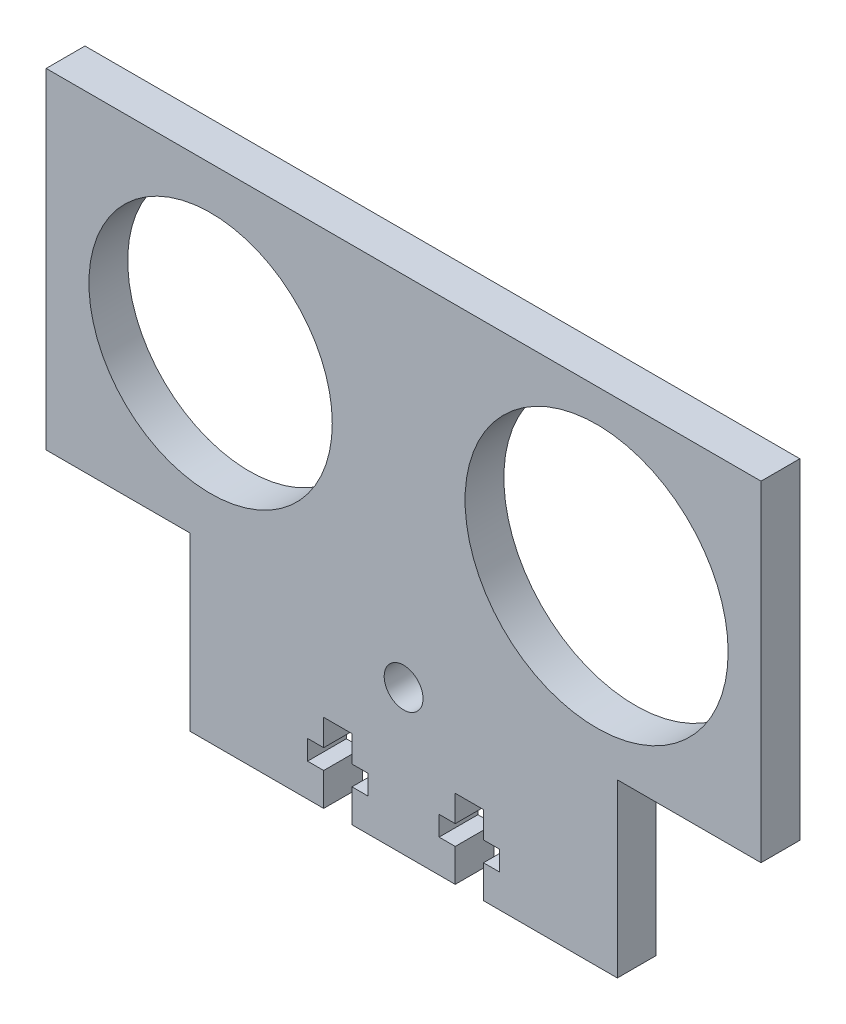
ISO-10303-21;
HEADER;
FILE_DESCRIPTION(('STEP AP214'),'2;1');
FILE_NAME('part.step','',(''),(''),'','','');
FILE_SCHEMA(('AUTOMOTIVE_DESIGN { 1 0 10303 214 1 1 1 1 }'));
ENDSEC;
DATA;
#1=APPLICATION_CONTEXT('core data for automotive mechanical design processes');
#2=APPLICATION_PROTOCOL_DEFINITION('international standard','automotive_design',2000,#1);
#3=PRODUCT_CONTEXT('',#1,'mechanical');
#4=PRODUCT('Part','Part','',(#3));
#5=PRODUCT_RELATED_PRODUCT_CATEGORY('part','',(#4));
#6=PRODUCT_DEFINITION_FORMATION('','',#4);
#7=PRODUCT_DEFINITION_CONTEXT('part definition',#1,'design');
#8=PRODUCT_DEFINITION('design','',#6,#7);
#9=PRODUCT_DEFINITION_SHAPE('','',#8);
#10=(LENGTH_UNIT() NAMED_UNIT(*) SI_UNIT(.MILLI.,.METRE.));
#11=(NAMED_UNIT(*) PLANE_ANGLE_UNIT() SI_UNIT($,.RADIAN.));
#12=(NAMED_UNIT(*) SI_UNIT($,.STERADIAN.) SOLID_ANGLE_UNIT());
#13=UNCERTAINTY_MEASURE_WITH_UNIT(LENGTH_MEASURE(1.E-05),#10,'distance_accuracy_value','');
#14=(GEOMETRIC_REPRESENTATION_CONTEXT(3) GLOBAL_UNCERTAINTY_ASSIGNED_CONTEXT((#13)) GLOBAL_UNIT_ASSIGNED_CONTEXT((#10,
#11,#12)) REPRESENTATION_CONTEXT('',''));
#15=CARTESIAN_POINT('',(0.,0.,0.));
#16=DIRECTION('',(0.,0.,1.));
#17=DIRECTION('',(1.,0.,0.));
#18=AXIS2_PLACEMENT_3D('',#15,#16,#17);
#19=CARTESIAN_POINT('',(-32.5,-22.,5.9));
#20=DIRECTION('',(0.,1.,0.));
#21=DIRECTION('',(-1.,0.,0.));
#22=AXIS2_PLACEMENT_3D('',#19,#20,#21);
#23=PLANE('',#22);
#24=DIRECTION('',(1.,0.,0.));
#25=VECTOR('',#24,1.);
#26=CARTESIAN_POINT('',(-32.5,-22.,5.9));
#27=LINE('',#26,#25);
#28=CARTESIAN_POINT('',(12.15,-22.,5.9));
#29=VERTEX_POINT('',#28);
#30=CARTESIAN_POINT('',(32.5,-22.,5.9));
#31=VERTEX_POINT('',#30);
#32=EDGE_CURVE('E453',#29,#31,#27,.T.);
#33=ORIENTED_EDGE('',*,*,#32,.F.);
#34=DIRECTION('',(0.,0.,1.));
#35=VECTOR('',#34,1.);
#36=CARTESIAN_POINT('',(12.15,-22.,0.));
#37=LINE('',#36,#35);
#38=CARTESIAN_POINT('',(12.15,-22.,0.));
#39=VERTEX_POINT('',#38);
#40=EDGE_CURVE('E335',#39,#29,#37,.T.);
#41=ORIENTED_EDGE('',*,*,#40,.F.);
#42=DIRECTION('',(1.,0.,0.));
#43=VECTOR('',#42,1.);
#44=CARTESIAN_POINT('',(-32.5,-22.,0.));
#45=LINE('',#44,#43);
#46=CARTESIAN_POINT('',(32.5,-22.,0.));
#47=VERTEX_POINT('',#46);
#48=EDGE_CURVE('E445',#39,#47,#45,.T.);
#49=ORIENTED_EDGE('',*,*,#48,.T.);
#50=DIRECTION('',(0.,0.,-1.));
#51=VECTOR('',#50,1.);
#52=CARTESIAN_POINT('',(32.5,-22.,5.9));
#53=LINE('',#52,#51);
#54=EDGE_CURVE('E11',#31,#47,#53,.T.);
#55=ORIENTED_EDGE('',*,*,#54,.F.);
#56=EDGE_LOOP('',(#33,#41,#49,#55));
#57=FACE_BOUND('',#56,.T.);
#58=ADVANCED_FACE('F32',(#57),#23,.F.);
#59=CARTESIAN_POINT('',(-32.5,-22.,0.));
#60=VERTEX_POINT('',#59);
#61=CARTESIAN_POINT('',(-12.15,-22.,0.));
#62=VERTEX_POINT('',#61);
#63=EDGE_CURVE('E468',#60,#62,#45,.T.);
#64=ORIENTED_EDGE('',*,*,#63,.T.);
#65=DIRECTION('',(0.,0.,1.));
#66=VECTOR('',#65,1.);
#67=CARTESIAN_POINT('',(-12.15,-22.,0.));
#68=LINE('',#67,#66);
#69=CARTESIAN_POINT('',(-12.15,-22.,5.9));
#70=VERTEX_POINT('',#69);
#71=EDGE_CURVE('E374',#62,#70,#68,.T.);
#72=ORIENTED_EDGE('',*,*,#71,.T.);
#73=CARTESIAN_POINT('',(-32.5,-22.,5.9));
#74=VERTEX_POINT('',#73);
#75=EDGE_CURVE('E448',#74,#70,#27,.T.);
#76=ORIENTED_EDGE('',*,*,#75,.F.);
#77=DIRECTION('',(0.,0.,-1.));
#78=VECTOR('',#77,1.);
#79=CARTESIAN_POINT('',(-32.5,-22.,5.9));
#80=LINE('',#79,#78);
#81=EDGE_CURVE('E467',#74,#60,#80,.T.);
#82=ORIENTED_EDGE('',*,*,#81,.T.);
#83=EDGE_LOOP('',(#64,#72,#76,#82));
#84=FACE_BOUND('',#83,.T.);
#85=ADVANCED_FACE('F589',(#84),#23,.F.);
#86=CARTESIAN_POINT('',(0.,0.,5.9));
#87=DIRECTION('',(0.,0.,1.));
#88=DIRECTION('',(1.,0.,0.));
#89=AXIS2_PLACEMENT_3D('',#86,#87,#88);
#90=PLANE('',#89);
#91=DIRECTION('',(0.,1.,0.));
#92=VECTOR('',#91,1.);
#93=CARTESIAN_POINT('',(12.15,-22.,5.9));
#94=LINE('',#93,#92);
#95=CARTESIAN_POINT('',(12.15,-17.,5.9));
#96=VERTEX_POINT('',#95);
#97=EDGE_CURVE('E303',#29,#96,#94,.T.);
#98=ORIENTED_EDGE('',*,*,#97,.F.);
#99=ORIENTED_EDGE('',*,*,#32,.T.);
#100=DIRECTION('',(0.,1.,0.));
#101=VECTOR('',#100,1.);
#102=CARTESIAN_POINT('',(32.5,-22.,5.9));
#103=LINE('',#102,#101);
#104=CARTESIAN_POINT('',(32.5,4.10000000000001,5.9));
#105=VERTEX_POINT('',#104);
#106=EDGE_CURVE('E451',#31,#105,#103,.T.);
#107=ORIENTED_EDGE('',*,*,#106,.T.);
#108=DIRECTION('',(1.,0.,0.));
#109=VECTOR('',#108,1.);
#110=CARTESIAN_POINT('',(54.3449314192418,4.1,5.9));
#111=LINE('',#110,#109);
#112=CARTESIAN_POINT('',(54.3449314192418,4.1,5.9));
#113=VERTEX_POINT('',#112);
#114=EDGE_CURVE('E455',#105,#113,#111,.T.);
#115=ORIENTED_EDGE('',*,*,#114,.T.);
#116=DIRECTION('',(0.,1.,0.));
#117=VECTOR('',#116,1.);
#118=CARTESIAN_POINT('',(54.3449314192418,54.3449314192417,5.9));
#119=LINE('',#118,#117);
#120=CARTESIAN_POINT('',(54.3449314192418,54.3449314192417,5.9));
#121=VERTEX_POINT('',#120);
#122=EDGE_CURVE('E457',#113,#121,#119,.T.);
#123=ORIENTED_EDGE('',*,*,#122,.T.);
#124=DIRECTION('',(-1.,0.,0.));
#125=VECTOR('',#124,1.);
#126=CARTESIAN_POINT('',(-54.3449314192418,54.3449314192417,5.9));
#127=LINE('',#126,#125);
#128=CARTESIAN_POINT('',(-54.3449314192418,54.3449314192417,5.9));
#129=VERTEX_POINT('',#128);
#130=EDGE_CURVE('E459',#121,#129,#127,.T.);
#131=ORIENTED_EDGE('',*,*,#130,.T.);
#132=DIRECTION('',(0.,-1.,0.));
#133=VECTOR('',#132,1.);
#134=CARTESIAN_POINT('',(-54.3449314192418,4.1,5.9));
#135=LINE('',#134,#133);
#136=CARTESIAN_POINT('',(-54.3449314192418,4.1,5.9));
#137=VERTEX_POINT('',#136);
#138=EDGE_CURVE('E461',#129,#137,#135,.T.);
#139=ORIENTED_EDGE('',*,*,#138,.T.);
#140=DIRECTION('',(1.,0.,0.));
#141=VECTOR('',#140,1.);
#142=CARTESIAN_POINT('',(-32.5,4.1,5.9));
#143=LINE('',#142,#141);
#144=CARTESIAN_POINT('',(-32.5,4.1,5.9));
#145=VERTEX_POINT('',#144);
#146=EDGE_CURVE('E463',#137,#145,#143,.T.);
#147=ORIENTED_EDGE('',*,*,#146,.T.);
#148=DIRECTION('',(0.,-1.,0.));
#149=VECTOR('',#148,1.);
#150=CARTESIAN_POINT('',(-32.5,4.1,5.9));
#151=LINE('',#150,#149);
#152=EDGE_CURVE('E465',#145,#74,#151,.T.);
#153=ORIENTED_EDGE('',*,*,#152,.T.);
#154=ORIENTED_EDGE('',*,*,#75,.T.);
#155=DIRECTION('',(0.,-1.,0.));
#156=VECTOR('',#155,1.);
#157=CARTESIAN_POINT('',(-12.15,-22.,5.9));
#158=LINE('',#157,#156);
#159=CARTESIAN_POINT('',(-12.15,-17.,5.9));
#160=VERTEX_POINT('',#159);
#161=EDGE_CURVE('E322',#160,#70,#158,.T.);
#162=ORIENTED_EDGE('',*,*,#161,.F.);
#163=DIRECTION('',(1.,0.,0.));
#164=VECTOR('',#163,1.);
#165=CARTESIAN_POINT('',(-14.6,-17.,5.9));
#166=LINE('',#165,#164);
#167=CARTESIAN_POINT('',(-14.6,-17.,5.9));
#168=VERTEX_POINT('',#167);
#169=EDGE_CURVE('E345',#168,#160,#166,.T.);
#170=ORIENTED_EDGE('',*,*,#169,.F.);
#171=DIRECTION('',(0.,-1.,0.));
#172=VECTOR('',#171,1.);
#173=CARTESIAN_POINT('',(-14.6,-14.,5.9));
#174=LINE('',#173,#172);
#175=CARTESIAN_POINT('',(-14.6,-14.,5.9));
#176=VERTEX_POINT('',#175);
#177=EDGE_CURVE('E400',#176,#168,#174,.T.);
#178=ORIENTED_EDGE('',*,*,#177,.F.);
#179=DIRECTION('',(-1.,0.,0.));
#180=VECTOR('',#179,1.);
#181=CARTESIAN_POINT('',(-14.6,-14.,5.9));
#182=LINE('',#181,#180);
#183=CARTESIAN_POINT('',(-12.15,-14.,5.9));
#184=VERTEX_POINT('',#183);
#185=EDGE_CURVE('E397',#184,#176,#182,.T.);
#186=ORIENTED_EDGE('',*,*,#185,.F.);
#187=DIRECTION('',(0.,-1.,0.));
#188=VECTOR('',#187,1.);
#189=CARTESIAN_POINT('',(-12.15,-14.,5.9));
#190=LINE('',#189,#188);
#191=CARTESIAN_POINT('',(-12.15,-10.,5.9));
#192=VERTEX_POINT('',#191);
#193=EDGE_CURVE('E394',#192,#184,#190,.T.);
#194=ORIENTED_EDGE('',*,*,#193,.F.);
#195=DIRECTION('',(-1.,0.,0.));
#196=VECTOR('',#195,1.);
#197=CARTESIAN_POINT('',(-12.15,-10.,5.9));
#198=LINE('',#197,#196);
#199=CARTESIAN_POINT('',(-7.85,-10.,5.9));
#200=VERTEX_POINT('',#199);
#201=EDGE_CURVE('E391',#200,#192,#198,.T.);
#202=ORIENTED_EDGE('',*,*,#201,.F.);
#203=DIRECTION('',(0.,1.,0.));
#204=VECTOR('',#203,1.);
#205=CARTESIAN_POINT('',(-7.84999999999999,-14.,5.9));
#206=LINE('',#205,#204);
#207=CARTESIAN_POINT('',(-7.84999999999999,-14.,5.9));
#208=VERTEX_POINT('',#207);
#209=EDGE_CURVE('E388',#208,#200,#206,.T.);
#210=ORIENTED_EDGE('',*,*,#209,.F.);
#211=DIRECTION('',(-1.,0.,0.));
#212=VECTOR('',#211,1.);
#213=CARTESIAN_POINT('',(-7.84999999999999,-14.,5.9));
#214=LINE('',#213,#212);
#215=CARTESIAN_POINT('',(-5.4,-14.,5.9));
#216=VERTEX_POINT('',#215);
#217=EDGE_CURVE('E385',#216,#208,#214,.T.);
#218=ORIENTED_EDGE('',*,*,#217,.F.);
#219=DIRECTION('',(0.,1.,0.));
#220=VECTOR('',#219,1.);
#221=CARTESIAN_POINT('',(-5.4,-14.,5.9));
#222=LINE('',#221,#220);
#223=CARTESIAN_POINT('',(-5.4,-17.,5.9));
#224=VERTEX_POINT('',#223);
#225=EDGE_CURVE('E382',#224,#216,#222,.T.);
#226=ORIENTED_EDGE('',*,*,#225,.F.);
#227=DIRECTION('',(1.,0.,0.));
#228=VECTOR('',#227,1.);
#229=CARTESIAN_POINT('',(-7.85,-17.,5.9));
#230=LINE('',#229,#228);
#231=CARTESIAN_POINT('',(-7.85,-17.,5.9));
#232=VERTEX_POINT('',#231);
#233=EDGE_CURVE('E379',#232,#224,#230,.T.);
#234=ORIENTED_EDGE('',*,*,#233,.F.);
#235=DIRECTION('',(0.,1.,0.));
#236=VECTOR('',#235,1.);
#237=CARTESIAN_POINT('',(-7.85,-22.,5.9));
#238=LINE('',#237,#236);
#239=CARTESIAN_POINT('',(-7.85,-22.,5.9));
#240=VERTEX_POINT('',#239);
#241=EDGE_CURVE('E376',#240,#232,#238,.T.);
#242=ORIENTED_EDGE('',*,*,#241,.F.);
#243=CARTESIAN_POINT('',(7.85,-22.,5.9));
#244=VERTEX_POINT('',#243);
#245=EDGE_CURVE('E452',#240,#244,#27,.T.);
#246=ORIENTED_EDGE('',*,*,#245,.T.);
#247=DIRECTION('',(0.,-1.,0.));
#248=VECTOR('',#247,1.);
#249=CARTESIAN_POINT('',(7.85,-22.,5.9));
#250=LINE('',#249,#248);
#251=CARTESIAN_POINT('',(7.85,-17.,5.9));
#252=VERTEX_POINT('',#251);
#253=EDGE_CURVE('E47',#252,#244,#250,.T.);
#254=ORIENTED_EDGE('',*,*,#253,.F.);
#255=DIRECTION('',(1.,0.,0.));
#256=VECTOR('',#255,1.);
#257=CARTESIAN_POINT('',(7.85,-17.,5.9));
#258=LINE('',#257,#256);
#259=CARTESIAN_POINT('',(5.4,-17.,5.9));
#260=VERTEX_POINT('',#259);
#261=EDGE_CURVE('E299',#260,#252,#258,.T.);
#262=ORIENTED_EDGE('',*,*,#261,.F.);
#263=DIRECTION('',(0.,-1.,0.));
#264=VECTOR('',#263,1.);
#265=CARTESIAN_POINT('',(5.4,-14.,5.9));
#266=LINE('',#265,#264);
#267=CARTESIAN_POINT('',(5.4,-14.,5.9));
#268=VERTEX_POINT('',#267);
#269=EDGE_CURVE('E297',#268,#260,#266,.T.);
#270=ORIENTED_EDGE('',*,*,#269,.F.);
#271=DIRECTION('',(-1.,0.,0.));
#272=VECTOR('',#271,1.);
#273=CARTESIAN_POINT('',(7.85,-14.,5.9));
#274=LINE('',#273,#272);
#275=CARTESIAN_POINT('',(7.85,-14.,5.9));
#276=VERTEX_POINT('',#275);
#277=EDGE_CURVE('E248',#276,#268,#274,.T.);
#278=ORIENTED_EDGE('',*,*,#277,.F.);
#279=DIRECTION('',(0.,-1.,0.));
#280=VECTOR('',#279,1.);
#281=CARTESIAN_POINT('',(7.85,-14.,5.9));
#282=LINE('',#281,#280);
#283=CARTESIAN_POINT('',(7.85,-10.,5.9));
#284=VERTEX_POINT('',#283);
#285=EDGE_CURVE('E268',#284,#276,#282,.T.);
#286=ORIENTED_EDGE('',*,*,#285,.F.);
#287=DIRECTION('',(-1.,0.,0.));
#288=VECTOR('',#287,1.);
#289=CARTESIAN_POINT('',(12.15,-9.99999999999999,5.9));
#290=LINE('',#289,#288);
#291=CARTESIAN_POINT('',(12.15,-9.99999999999999,5.9));
#292=VERTEX_POINT('',#291);
#293=EDGE_CURVE('E271',#292,#284,#290,.T.);
#294=ORIENTED_EDGE('',*,*,#293,.F.);
#295=DIRECTION('',(0.,1.,0.));
#296=VECTOR('',#295,1.);
#297=CARTESIAN_POINT('',(12.15,-14.,5.9));
#298=LINE('',#297,#296);
#299=CARTESIAN_POINT('',(12.15,-14.,5.9));
#300=VERTEX_POINT('',#299);
#301=EDGE_CURVE('E315',#300,#292,#298,.T.);
#302=ORIENTED_EDGE('',*,*,#301,.F.);
#303=DIRECTION('',(-1.,0.,0.));
#304=VECTOR('',#303,1.);
#305=CARTESIAN_POINT('',(14.6,-14.,5.9));
#306=LINE('',#305,#304);
#307=CARTESIAN_POINT('',(14.6,-14.,5.9));
#308=VERTEX_POINT('',#307);
#309=EDGE_CURVE('E312',#308,#300,#306,.T.);
#310=ORIENTED_EDGE('',*,*,#309,.F.);
#311=DIRECTION('',(0.,1.,0.));
#312=VECTOR('',#311,1.);
#313=CARTESIAN_POINT('',(14.6,-14.,5.9));
#314=LINE('',#313,#312);
#315=CARTESIAN_POINT('',(14.6,-17.,5.9));
#316=VERTEX_POINT('',#315);
#317=EDGE_CURVE('E309',#316,#308,#314,.T.);
#318=ORIENTED_EDGE('',*,*,#317,.F.);
#319=DIRECTION('',(1.,0.,0.));
#320=VECTOR('',#319,1.);
#321=CARTESIAN_POINT('',(14.6,-17.,5.9));
#322=LINE('',#321,#320);
#323=EDGE_CURVE('E306',#96,#316,#322,.T.);
#324=ORIENTED_EDGE('',*,*,#323,.F.);
#325=EDGE_LOOP('',(#98,#99,#107,#115,#123,#131,#139,#147,#153,#154,#162,#170,#178,#186,#194,
#202,#210,#218,#226,#234,#242,#246,#254,#262,#270,#278,#286,#294,#302,#310,#318,#324));
#326=FACE_BOUND('',#325,.T.);
#327=CARTESIAN_POINT('',(-29.3449314192418,29.3449314192417,5.9));
#328=DIRECTION('',(0.,0.,1.));
#329=DIRECTION('',(1.,0.,0.));
#330=AXIS2_PLACEMENT_3D('',#327,#328,#329);
#331=CIRCLE('',#330,18.5);
#332=CARTESIAN_POINT('',(-10.8449314192418,29.3449314192417,5.9));
#333=VERTEX_POINT('',#332);
#334=EDGE_CURVE('E436',#333,#333,#331,.T.);
#335=ORIENTED_EDGE('',*,*,#334,.F.);
#336=EDGE_LOOP('',(#335));
#337=FACE_BOUND('',#336,.T.);
#338=CARTESIAN_POINT('',(0.,0.,5.9));
#339=DIRECTION('',(0.,0.,1.));
#340=DIRECTION('',(1.,0.,0.));
#341=AXIS2_PLACEMENT_3D('',#338,#339,#340);
#342=CIRCLE('',#341,2.95);
#343=CARTESIAN_POINT('',(2.95,0.,5.9));
#344=VERTEX_POINT('',#343);
#345=EDGE_CURVE('E442',#344,#344,#342,.T.);
#346=ORIENTED_EDGE('',*,*,#345,.F.);
#347=EDGE_LOOP('',(#346));
#348=FACE_BOUND('',#347,.T.);
#349=CARTESIAN_POINT('',(29.3449314192418,29.3449314192417,5.9));
#350=DIRECTION('',(0.,0.,1.));
#351=DIRECTION('',(1.,0.,0.));
#352=AXIS2_PLACEMENT_3D('',#349,#350,#351);
#353=CIRCLE('',#352,20.);
#354=CARTESIAN_POINT('',(49.3449314192418,29.3449314192417,5.9));
#355=VERTEX_POINT('',#354);
#356=EDGE_CURVE('E430',#355,#355,#353,.T.);
#357=ORIENTED_EDGE('',*,*,#356,.F.);
#358=EDGE_LOOP('',(#357));
#359=FACE_BOUND('',#358,.T.);
#360=ADVANCED_FACE('F526',(#326,#337,#348,#359),#90,.T.);
#361=CARTESIAN_POINT('',(0.,0.,0.));
#362=DIRECTION('',(0.,0.,1.));
#363=DIRECTION('',(1.,0.,0.));
#364=AXIS2_PLACEMENT_3D('',#361,#362,#363);
#365=PLANE('',#364);
#366=ORIENTED_EDGE('',*,*,#48,.F.);
#367=DIRECTION('',(0.,1.,0.));
#368=VECTOR('',#367,1.);
#369=CARTESIAN_POINT('',(12.15,-22.,0.));
#370=LINE('',#369,#368);
#371=CARTESIAN_POINT('',(12.15,-17.,0.));
#372=VERTEX_POINT('',#371);
#373=EDGE_CURVE('E278',#39,#372,#370,.T.);
#374=ORIENTED_EDGE('',*,*,#373,.T.);
#375=DIRECTION('',(1.,0.,0.));
#376=VECTOR('',#375,1.);
#377=CARTESIAN_POINT('',(14.6,-17.,0.));
#378=LINE('',#377,#376);
#379=CARTESIAN_POINT('',(14.6,-17.,0.));
#380=VERTEX_POINT('',#379);
#381=EDGE_CURVE('E281',#372,#380,#378,.T.);
#382=ORIENTED_EDGE('',*,*,#381,.T.);
#383=DIRECTION('',(0.,1.,0.));
#384=VECTOR('',#383,1.);
#385=CARTESIAN_POINT('',(14.6,-14.,0.));
#386=LINE('',#385,#384);
#387=CARTESIAN_POINT('',(14.6,-14.,0.));
#388=VERTEX_POINT('',#387);
#389=EDGE_CURVE('E284',#380,#388,#386,.T.);
#390=ORIENTED_EDGE('',*,*,#389,.T.);
#391=DIRECTION('',(-1.,0.,0.));
#392=VECTOR('',#391,1.);
#393=CARTESIAN_POINT('',(14.6,-14.,0.));
#394=LINE('',#393,#392);
#395=CARTESIAN_POINT('',(12.15,-14.,0.));
#396=VERTEX_POINT('',#395);
#397=EDGE_CURVE('E287',#388,#396,#394,.T.);
#398=ORIENTED_EDGE('',*,*,#397,.T.);
#399=DIRECTION('',(0.,1.,0.));
#400=VECTOR('',#399,1.);
#401=CARTESIAN_POINT('',(12.15,-14.,0.));
#402=LINE('',#401,#400);
#403=CARTESIAN_POINT('',(12.15,-9.99999999999999,0.));
#404=VERTEX_POINT('',#403);
#405=EDGE_CURVE('E290',#396,#404,#402,.T.);
#406=ORIENTED_EDGE('',*,*,#405,.T.);
#407=DIRECTION('',(-1.,0.,0.));
#408=VECTOR('',#407,1.);
#409=CARTESIAN_POINT('',(12.15,-9.99999999999999,0.));
#410=LINE('',#409,#408);
#411=CARTESIAN_POINT('',(7.85,-10.,0.));
#412=VERTEX_POINT('',#411);
#413=EDGE_CURVE('E293',#404,#412,#410,.T.);
#414=ORIENTED_EDGE('',*,*,#413,.T.);
#415=DIRECTION('',(0.,-1.,0.));
#416=VECTOR('',#415,1.);
#417=CARTESIAN_POINT('',(7.85,-14.,0.));
#418=LINE('',#417,#416);
#419=CARTESIAN_POINT('',(7.85,-14.,0.));
#420=VERTEX_POINT('',#419);
#421=EDGE_CURVE('E253',#412,#420,#418,.T.);
#422=ORIENTED_EDGE('',*,*,#421,.T.);
#423=DIRECTION('',(-1.,0.,0.));
#424=VECTOR('',#423,1.);
#425=CARTESIAN_POINT('',(7.85,-14.,0.));
#426=LINE('',#425,#424);
#427=CARTESIAN_POINT('',(5.4,-14.,0.));
#428=VERTEX_POINT('',#427);
#429=EDGE_CURVE('E245',#420,#428,#426,.T.);
#430=ORIENTED_EDGE('',*,*,#429,.T.);
#431=DIRECTION('',(0.,-1.,0.));
#432=VECTOR('',#431,1.);
#433=CARTESIAN_POINT('',(5.4,-14.,0.));
#434=LINE('',#433,#432);
#435=CARTESIAN_POINT('',(5.4,-17.,0.));
#436=VERTEX_POINT('',#435);
#437=EDGE_CURVE('E256',#428,#436,#434,.T.);
#438=ORIENTED_EDGE('',*,*,#437,.T.);
#439=DIRECTION('',(1.,0.,0.));
#440=VECTOR('',#439,1.);
#441=CARTESIAN_POINT('',(7.85,-17.,0.));
#442=LINE('',#441,#440);
#443=CARTESIAN_POINT('',(7.85,-17.,0.));
#444=VERTEX_POINT('',#443);
#445=EDGE_CURVE('E261',#436,#444,#442,.T.);
#446=ORIENTED_EDGE('',*,*,#445,.T.);
#447=DIRECTION('',(0.,-1.,0.));
#448=VECTOR('',#447,1.);
#449=CARTESIAN_POINT('',(7.85,-22.,0.));
#450=LINE('',#449,#448);
#451=CARTESIAN_POINT('',(7.85,-22.,0.));
#452=VERTEX_POINT('',#451);
#453=EDGE_CURVE('E275',#444,#452,#450,.T.);
#454=ORIENTED_EDGE('',*,*,#453,.T.);
#455=CARTESIAN_POINT('',(-7.85,-22.,0.));
#456=VERTEX_POINT('',#455);
#457=EDGE_CURVE('E472',#456,#452,#45,.T.);
#458=ORIENTED_EDGE('',*,*,#457,.F.);
#459=DIRECTION('',(0.,1.,0.));
#460=VECTOR('',#459,1.);
#461=CARTESIAN_POINT('',(-7.85,-22.,0.));
#462=LINE('',#461,#460);
#463=CARTESIAN_POINT('',(-7.85,-17.,0.));
#464=VERTEX_POINT('',#463);
#465=EDGE_CURVE('E55',#456,#464,#462,.T.);
#466=ORIENTED_EDGE('',*,*,#465,.T.);
#467=DIRECTION('',(1.,0.,0.));
#468=VECTOR('',#467,1.);
#469=CARTESIAN_POINT('',(-7.85,-17.,0.));
#470=LINE('',#469,#468);
#471=CARTESIAN_POINT('',(-5.4,-17.,0.));
#472=VERTEX_POINT('',#471);
#473=EDGE_CURVE('E347',#464,#472,#470,.T.);
#474=ORIENTED_EDGE('',*,*,#473,.T.);
#475=DIRECTION('',(0.,1.,0.));
#476=VECTOR('',#475,1.);
#477=CARTESIAN_POINT('',(-5.4,-14.,0.));
#478=LINE('',#477,#476);
#479=CARTESIAN_POINT('',(-5.4,-14.,0.));
#480=VERTEX_POINT('',#479);
#481=EDGE_CURVE('E350',#472,#480,#478,.T.);
#482=ORIENTED_EDGE('',*,*,#481,.T.);
#483=DIRECTION('',(-1.,0.,0.));
#484=VECTOR('',#483,1.);
#485=CARTESIAN_POINT('',(-7.84999999999999,-14.,0.));
#486=LINE('',#485,#484);
#487=CARTESIAN_POINT('',(-7.84999999999999,-14.,0.));
#488=VERTEX_POINT('',#487);
#489=EDGE_CURVE('E353',#480,#488,#486,.T.);
#490=ORIENTED_EDGE('',*,*,#489,.T.);
#491=DIRECTION('',(0.,1.,0.));
#492=VECTOR('',#491,1.);
#493=CARTESIAN_POINT('',(-7.84999999999999,-14.,0.));
#494=LINE('',#493,#492);
#495=CARTESIAN_POINT('',(-7.85,-10.,0.));
#496=VERTEX_POINT('',#495);
#497=EDGE_CURVE('E356',#488,#496,#494,.T.);
#498=ORIENTED_EDGE('',*,*,#497,.T.);
#499=DIRECTION('',(-1.,0.,0.));
#500=VECTOR('',#499,1.);
#501=CARTESIAN_POINT('',(-12.15,-10.,0.));
#502=LINE('',#501,#500);
#503=CARTESIAN_POINT('',(-12.15,-10.,0.));
#504=VERTEX_POINT('',#503);
#505=EDGE_CURVE('E359',#496,#504,#502,.T.);
#506=ORIENTED_EDGE('',*,*,#505,.T.);
#507=DIRECTION('',(0.,-1.,0.));
#508=VECTOR('',#507,1.);
#509=CARTESIAN_POINT('',(-12.15,-14.,0.));
#510=LINE('',#509,#508);
#511=CARTESIAN_POINT('',(-12.15,-14.,0.));
#512=VERTEX_POINT('',#511);
#513=EDGE_CURVE('E362',#504,#512,#510,.T.);
#514=ORIENTED_EDGE('',*,*,#513,.T.);
#515=DIRECTION('',(-1.,0.,0.));
#516=VECTOR('',#515,1.);
#517=CARTESIAN_POINT('',(-14.6,-14.,0.));
#518=LINE('',#517,#516);
#519=CARTESIAN_POINT('',(-14.6,-14.,0.));
#520=VERTEX_POINT('',#519);
#521=EDGE_CURVE('E365',#512,#520,#518,.T.);
#522=ORIENTED_EDGE('',*,*,#521,.T.);
#523=DIRECTION('',(0.,-1.,0.));
#524=VECTOR('',#523,1.);
#525=CARTESIAN_POINT('',(-14.6,-14.,0.));
#526=LINE('',#525,#524);
#527=CARTESIAN_POINT('',(-14.6,-17.,0.));
#528=VERTEX_POINT('',#527);
#529=EDGE_CURVE('E368',#520,#528,#526,.T.);
#530=ORIENTED_EDGE('',*,*,#529,.T.);
#531=DIRECTION('',(1.,0.,0.));
#532=VECTOR('',#531,1.);
#533=CARTESIAN_POINT('',(-14.6,-17.,0.));
#534=LINE('',#533,#532);
#535=CARTESIAN_POINT('',(-12.15,-17.,0.));
#536=VERTEX_POINT('',#535);
#537=EDGE_CURVE('E371',#528,#536,#534,.T.);
#538=ORIENTED_EDGE('',*,*,#537,.T.);
#539=DIRECTION('',(0.,-1.,0.));
#540=VECTOR('',#539,1.);
#541=CARTESIAN_POINT('',(-12.15,-22.,0.));
#542=LINE('',#541,#540);
#543=EDGE_CURVE('E342',#536,#62,#542,.T.);
#544=ORIENTED_EDGE('',*,*,#543,.T.);
#545=ORIENTED_EDGE('',*,*,#63,.F.);
#546=DIRECTION('',(0.,-1.,0.));
#547=VECTOR('',#546,1.);
#548=CARTESIAN_POINT('',(-32.5,4.1,0.));
#549=LINE('',#548,#547);
#550=CARTESIAN_POINT('',(-32.5,4.1,0.));
#551=VERTEX_POINT('',#550);
#552=EDGE_CURVE('E484',#551,#60,#549,.T.);
#553=ORIENTED_EDGE('',*,*,#552,.F.);
#554=DIRECTION('',(1.,0.,0.));
#555=VECTOR('',#554,1.);
#556=CARTESIAN_POINT('',(-32.5,4.1,0.));
#557=LINE('',#556,#555);
#558=CARTESIAN_POINT('',(-54.3449314192418,4.1,0.));
#559=VERTEX_POINT('',#558);
#560=EDGE_CURVE('E482',#559,#551,#557,.T.);
#561=ORIENTED_EDGE('',*,*,#560,.F.);
#562=DIRECTION('',(0.,-1.,0.));
#563=VECTOR('',#562,1.);
#564=CARTESIAN_POINT('',(-54.3449314192418,4.1,0.));
#565=LINE('',#564,#563);
#566=CARTESIAN_POINT('',(-54.3449314192418,54.3449314192417,0.));
#567=VERTEX_POINT('',#566);
#568=EDGE_CURVE('E480',#567,#559,#565,.T.);
#569=ORIENTED_EDGE('',*,*,#568,.F.);
#570=DIRECTION('',(-1.,0.,0.));
#571=VECTOR('',#570,1.);
#572=CARTESIAN_POINT('',(-54.3449314192418,54.3449314192417,0.));
#573=LINE('',#572,#571);
#574=CARTESIAN_POINT('',(54.3449314192418,54.3449314192417,0.));
#575=VERTEX_POINT('',#574);
#576=EDGE_CURVE('E478',#575,#567,#573,.T.);
#577=ORIENTED_EDGE('',*,*,#576,.F.);
#578=DIRECTION('',(0.,1.,0.));
#579=VECTOR('',#578,1.);
#580=CARTESIAN_POINT('',(54.3449314192418,54.3449314192417,0.));
#581=LINE('',#580,#579);
#582=CARTESIAN_POINT('',(54.3449314192418,4.1,0.));
#583=VERTEX_POINT('',#582);
#584=EDGE_CURVE('E476',#583,#575,#581,.T.);
#585=ORIENTED_EDGE('',*,*,#584,.F.);
#586=DIRECTION('',(1.,0.,0.));
#587=VECTOR('',#586,1.);
#588=CARTESIAN_POINT('',(54.3449314192418,4.1,0.));
#589=LINE('',#588,#587);
#590=CARTESIAN_POINT('',(32.5,4.10000000000001,0.));
#591=VERTEX_POINT('',#590);
#592=EDGE_CURVE('E474',#591,#583,#589,.T.);
#593=ORIENTED_EDGE('',*,*,#592,.F.);
#594=DIRECTION('',(0.,1.,0.));
#595=VECTOR('',#594,1.);
#596=CARTESIAN_POINT('',(32.5,-22.,0.));
#597=LINE('',#596,#595);
#598=EDGE_CURVE('E471',#47,#591,#597,.T.);
#599=ORIENTED_EDGE('',*,*,#598,.F.);
#600=EDGE_LOOP('',(#366,#374,#382,#390,#398,#406,#414,#422,#430,#438,#446,#454,#458,#466,#474,
#482,#490,#498,#506,#514,#522,#530,#538,#544,#545,#553,#561,#569,#577,#585,#593,#599));
#601=FACE_BOUND('',#600,.T.);
#602=CARTESIAN_POINT('',(0.,0.,0.));
#603=DIRECTION('',(0.,0.,1.));
#604=DIRECTION('',(1.,0.,0.));
#605=AXIS2_PLACEMENT_3D('',#602,#603,#604);
#606=CIRCLE('',#605,2.95);
#607=CARTESIAN_POINT('',(2.95,0.,0.));
#608=VERTEX_POINT('',#607);
#609=EDGE_CURVE('E439',#608,#608,#606,.T.);
#610=ORIENTED_EDGE('',*,*,#609,.T.);
#611=EDGE_LOOP('',(#610));
#612=FACE_BOUND('',#611,.T.);
#613=CARTESIAN_POINT('',(-29.3449314192418,29.3449314192417,0.));
#614=DIRECTION('',(0.,0.,1.));
#615=DIRECTION('',(1.,0.,0.));
#616=AXIS2_PLACEMENT_3D('',#613,#614,#615);
#617=CIRCLE('',#616,18.5);
#618=CARTESIAN_POINT('',(-10.8449314192418,29.3449314192417,0.));
#619=VERTEX_POINT('',#618);
#620=EDGE_CURVE('E433',#619,#619,#617,.T.);
#621=ORIENTED_EDGE('',*,*,#620,.T.);
#622=EDGE_LOOP('',(#621));
#623=FACE_BOUND('',#622,.T.);
#624=CARTESIAN_POINT('',(29.3449314192418,29.3449314192417,0.));
#625=DIRECTION('',(0.,0.,1.));
#626=DIRECTION('',(1.,0.,0.));
#627=AXIS2_PLACEMENT_3D('',#624,#625,#626);
#628=CIRCLE('',#627,20.);
#629=CARTESIAN_POINT('',(49.3449314192418,29.3449314192417,0.));
#630=VERTEX_POINT('',#629);
#631=EDGE_CURVE('E407',#630,#630,#628,.T.);
#632=ORIENTED_EDGE('',*,*,#631,.T.);
#633=EDGE_LOOP('',(#632));
#634=FACE_BOUND('',#633,.T.);
#635=ADVANCED_FACE('F264',(#601,#612,#623,#634),#365,.F.);
#636=ORIENTED_EDGE('',*,*,#457,.T.);
#637=DIRECTION('',(0.,0.,1.));
#638=VECTOR('',#637,1.);
#639=CARTESIAN_POINT('',(7.85,-22.,0.));
#640=LINE('',#639,#638);
#641=EDGE_CURVE('E337',#452,#244,#640,.T.);
#642=ORIENTED_EDGE('',*,*,#641,.T.);
#643=ORIENTED_EDGE('',*,*,#245,.F.);
#644=DIRECTION('',(0.,0.,1.));
#645=VECTOR('',#644,1.);
#646=CARTESIAN_POINT('',(-7.85,-22.,0.));
#647=LINE('',#646,#645);
#648=EDGE_CURVE('E426',#456,#240,#647,.T.);
#649=ORIENTED_EDGE('',*,*,#648,.F.);
#650=EDGE_LOOP('',(#636,#642,#643,#649));
#651=FACE_BOUND('',#650,.T.);
#652=ADVANCED_FACE('F34',(#651),#23,.F.);
#653=CARTESIAN_POINT('',(32.5,-22.,5.9));
#654=DIRECTION('',(-1.,0.,0.));
#655=DIRECTION('',(0.,-1.,0.));
#656=AXIS2_PLACEMENT_3D('',#653,#654,#655);
#657=PLANE('',#656);
#658=ORIENTED_EDGE('',*,*,#598,.T.);
#659=DIRECTION('',(0.,0.,-1.));
#660=VECTOR('',#659,1.);
#661=CARTESIAN_POINT('',(32.5,4.10000000000001,5.9));
#662=LINE('',#661,#660);
#663=EDGE_CURVE('E40',#105,#591,#662,.T.);
#664=ORIENTED_EDGE('',*,*,#663,.F.);
#665=ORIENTED_EDGE('',*,*,#106,.F.);
#666=ORIENTED_EDGE('',*,*,#54,.T.);
#667=EDGE_LOOP('',(#658,#664,#665,#666));
#668=FACE_BOUND('',#667,.T.);
#669=ADVANCED_FACE('F531',(#668),#657,.F.);
#670=CARTESIAN_POINT('',(54.3449314192418,4.1,5.9));
#671=DIRECTION('',(0.,1.,0.));
#672=DIRECTION('',(-1.,0.,0.));
#673=AXIS2_PLACEMENT_3D('',#670,#671,#672);
#674=PLANE('',#673);
#675=ORIENTED_EDGE('',*,*,#592,.T.);
#676=DIRECTION('',(0.,0.,-1.));
#677=VECTOR('',#676,1.);
#678=CARTESIAN_POINT('',(54.3449314192418,4.1,5.9));
#679=LINE('',#678,#677);
#680=EDGE_CURVE('E500',#113,#583,#679,.T.);
#681=ORIENTED_EDGE('',*,*,#680,.F.);
#682=ORIENTED_EDGE('',*,*,#114,.F.);
#683=ORIENTED_EDGE('',*,*,#663,.T.);
#684=EDGE_LOOP('',(#675,#681,#682,#683));
#685=FACE_BOUND('',#684,.T.);
#686=ADVANCED_FACE('F507',(#685),#674,.F.);
#687=CARTESIAN_POINT('',(54.3449314192418,54.3449314192417,5.9));
#688=DIRECTION('',(-1.,0.,0.));
#689=DIRECTION('',(0.,-1.,0.));
#690=AXIS2_PLACEMENT_3D('',#687,#688,#689);
#691=PLANE('',#690);
#692=ORIENTED_EDGE('',*,*,#584,.T.);
#693=DIRECTION('',(0.,0.,-1.));
#694=VECTOR('',#693,1.);
#695=CARTESIAN_POINT('',(54.3449314192418,54.3449314192417,5.9));
#696=LINE('',#695,#694);
#697=EDGE_CURVE('E497',#121,#575,#696,.T.);
#698=ORIENTED_EDGE('',*,*,#697,.F.);
#699=ORIENTED_EDGE('',*,*,#122,.F.);
#700=ORIENTED_EDGE('',*,*,#680,.T.);
#701=EDGE_LOOP('',(#692,#698,#699,#700));
#702=FACE_BOUND('',#701,.T.);
#703=ADVANCED_FACE('F517',(#702),#691,.F.);
#704=CARTESIAN_POINT('',(-54.3449314192418,54.3449314192417,5.9));
#705=DIRECTION('',(0.,-1.,0.));
#706=DIRECTION('',(0.,0.,-1.));
#707=AXIS2_PLACEMENT_3D('',#704,#705,#706);
#708=PLANE('',#707);
#709=ORIENTED_EDGE('',*,*,#576,.T.);
#710=DIRECTION('',(0.,0.,-1.));
#711=VECTOR('',#710,1.);
#712=CARTESIAN_POINT('',(-54.3449314192418,54.3449314192417,5.9));
#713=LINE('',#712,#711);
#714=EDGE_CURVE('E494',#129,#567,#713,.T.);
#715=ORIENTED_EDGE('',*,*,#714,.F.);
#716=ORIENTED_EDGE('',*,*,#130,.F.);
#717=ORIENTED_EDGE('',*,*,#697,.T.);
#718=EDGE_LOOP('',(#709,#715,#716,#717));
#719=FACE_BOUND('',#718,.T.);
#720=ADVANCED_FACE('F521',(#719),#708,.F.);
#721=CARTESIAN_POINT('',(-54.3449314192418,4.1,5.9));
#722=DIRECTION('',(1.,0.,0.));
#723=DIRECTION('',(0.,1.,0.));
#724=AXIS2_PLACEMENT_3D('',#721,#722,#723);
#725=PLANE('',#724);
#726=ORIENTED_EDGE('',*,*,#568,.T.);
#727=DIRECTION('',(0.,0.,-1.));
#728=VECTOR('',#727,1.);
#729=CARTESIAN_POINT('',(-54.3449314192418,4.1,5.9));
#730=LINE('',#729,#728);
#731=EDGE_CURVE('E491',#137,#559,#730,.T.);
#732=ORIENTED_EDGE('',*,*,#731,.F.);
#733=ORIENTED_EDGE('',*,*,#138,.F.);
#734=ORIENTED_EDGE('',*,*,#714,.T.);
#735=EDGE_LOOP('',(#726,#732,#733,#734));
#736=FACE_BOUND('',#735,.T.);
#737=ADVANCED_FACE('F601',(#736),#725,.F.);
#738=CARTESIAN_POINT('',(-32.5,4.1,5.9));
#739=DIRECTION('',(0.,1.,0.));
#740=DIRECTION('',(-1.,0.,0.));
#741=AXIS2_PLACEMENT_3D('',#738,#739,#740);
#742=PLANE('',#741);
#743=ORIENTED_EDGE('',*,*,#560,.T.);
#744=DIRECTION('',(0.,0.,-1.));
#745=VECTOR('',#744,1.);
#746=CARTESIAN_POINT('',(-32.5,4.1,5.9));
#747=LINE('',#746,#745);
#748=EDGE_CURVE('E488',#145,#551,#747,.T.);
#749=ORIENTED_EDGE('',*,*,#748,.F.);
#750=ORIENTED_EDGE('',*,*,#146,.F.);
#751=ORIENTED_EDGE('',*,*,#731,.T.);
#752=EDGE_LOOP('',(#743,#749,#750,#751));
#753=FACE_BOUND('',#752,.T.);
#754=ADVANCED_FACE('F598',(#753),#742,.F.);
#755=CARTESIAN_POINT('',(-32.5,4.1,5.9));
#756=DIRECTION('',(1.,0.,0.));
#757=DIRECTION('',(0.,1.,0.));
#758=AXIS2_PLACEMENT_3D('',#755,#756,#757);
#759=PLANE('',#758);
#760=ORIENTED_EDGE('',*,*,#552,.T.);
#761=ORIENTED_EDGE('',*,*,#81,.F.);
#762=ORIENTED_EDGE('',*,*,#152,.F.);
#763=ORIENTED_EDGE('',*,*,#748,.T.);
#764=EDGE_LOOP('',(#760,#761,#762,#763));
#765=FACE_BOUND('',#764,.T.);
#766=ADVANCED_FACE('F594',(#765),#759,.F.);
#767=CARTESIAN_POINT('',(0.,0.,5.9));
#768=DIRECTION('',(0.,0.,-1.));
#769=DIRECTION('',(-1.,0.,0.));
#770=AXIS2_PLACEMENT_3D('',#767,#768,#769);
#771=CYLINDRICAL_SURFACE('',#770,2.95);
#772=ORIENTED_EDGE('',*,*,#345,.T.);
#773=EDGE_LOOP('',(#772));
#774=FACE_BOUND('',#773,.T.);
#775=ORIENTED_EDGE('',*,*,#609,.F.);
#776=EDGE_LOOP('',(#775));
#777=FACE_BOUND('',#776,.T.);
#778=ADVANCED_FACE('F627',(#774,#777),#771,.F.);
#779=CARTESIAN_POINT('',(-29.3449314192418,29.3449314192417,5.9));
#780=DIRECTION('',(0.,0.,-1.));
#781=DIRECTION('',(-1.,0.,0.));
#782=AXIS2_PLACEMENT_3D('',#779,#780,#781);
#783=CYLINDRICAL_SURFACE('',#782,18.5);
#784=ORIENTED_EDGE('',*,*,#334,.T.);
#785=EDGE_LOOP('',(#784));
#786=FACE_BOUND('',#785,.T.);
#787=ORIENTED_EDGE('',*,*,#620,.F.);
#788=EDGE_LOOP('',(#787));
#789=FACE_BOUND('',#788,.T.);
#790=ADVANCED_FACE('F631',(#786,#789),#783,.F.);
#791=CARTESIAN_POINT('',(29.3449314192418,29.3449314192417,5.9));
#792=DIRECTION('',(0.,0.,-1.));
#793=DIRECTION('',(-1.,0.,0.));
#794=AXIS2_PLACEMENT_3D('',#791,#792,#793);
#795=CYLINDRICAL_SURFACE('',#794,20.);
#796=ORIENTED_EDGE('',*,*,#356,.T.);
#797=EDGE_LOOP('',(#796));
#798=FACE_BOUND('',#797,.T.);
#799=ORIENTED_EDGE('',*,*,#631,.F.);
#800=EDGE_LOOP('',(#799));
#801=FACE_BOUND('',#800,.T.);
#802=ADVANCED_FACE('F636',(#798,#801),#795,.F.);
#803=CARTESIAN_POINT('',(-12.15,-22.,0.));
#804=DIRECTION('',(-1.,0.,0.));
#805=DIRECTION('',(0.,0.,1.));
#806=AXIS2_PLACEMENT_3D('',#803,#804,#805);
#807=PLANE('',#806);
#808=ORIENTED_EDGE('',*,*,#161,.T.);
#809=ORIENTED_EDGE('',*,*,#71,.F.);
#810=ORIENTED_EDGE('',*,*,#543,.F.);
#811=DIRECTION('',(0.,0.,1.));
#812=VECTOR('',#811,1.);
#813=CARTESIAN_POINT('',(-12.15,-17.,0.));
#814=LINE('',#813,#812);
#815=EDGE_CURVE('E405',#536,#160,#814,.T.);
#816=ORIENTED_EDGE('',*,*,#815,.T.);
#817=EDGE_LOOP('',(#808,#809,#810,#816));
#818=FACE_BOUND('',#817,.T.);
#819=ADVANCED_FACE('F585',(#818),#807,.F.);
#820=CARTESIAN_POINT('',(-14.6,-17.,0.));
#821=DIRECTION('',(0.,-1.,0.));
#822=DIRECTION('',(0.,0.,-1.));
#823=AXIS2_PLACEMENT_3D('',#820,#821,#822);
#824=PLANE('',#823);
#825=ORIENTED_EDGE('',*,*,#169,.T.);
#826=ORIENTED_EDGE('',*,*,#815,.F.);
#827=ORIENTED_EDGE('',*,*,#537,.F.);
#828=DIRECTION('',(0.,0.,1.));
#829=VECTOR('',#828,1.);
#830=CARTESIAN_POINT('',(-14.6,-17.,0.));
#831=LINE('',#830,#829);
#832=EDGE_CURVE('E408',#528,#168,#831,.T.);
#833=ORIENTED_EDGE('',*,*,#832,.T.);
#834=EDGE_LOOP('',(#825,#826,#827,#833));
#835=FACE_BOUND('',#834,.T.);
#836=ADVANCED_FACE('F581',(#835),#824,.F.);
#837=CARTESIAN_POINT('',(-14.6,-14.,0.));
#838=DIRECTION('',(-1.,0.,0.));
#839=DIRECTION('',(0.,-1.,0.));
#840=AXIS2_PLACEMENT_3D('',#837,#838,#839);
#841=PLANE('',#840);
#842=ORIENTED_EDGE('',*,*,#177,.T.);
#843=ORIENTED_EDGE('',*,*,#832,.F.);
#844=ORIENTED_EDGE('',*,*,#529,.F.);
#845=DIRECTION('',(0.,0.,1.));
#846=VECTOR('',#845,1.);
#847=CARTESIAN_POINT('',(-14.6,-14.,0.));
#848=LINE('',#847,#846);
#849=EDGE_CURVE('E410',#520,#176,#848,.T.);
#850=ORIENTED_EDGE('',*,*,#849,.T.);
#851=EDGE_LOOP('',(#842,#843,#844,#850));
#852=FACE_BOUND('',#851,.T.);
#853=ADVANCED_FACE('F577',(#852),#841,.F.);
#854=CARTESIAN_POINT('',(-14.6,-14.,0.));
#855=DIRECTION('',(0.,1.,0.));
#856=DIRECTION('',(0.,0.,1.));
#857=AXIS2_PLACEMENT_3D('',#854,#855,#856);
#858=PLANE('',#857);
#859=ORIENTED_EDGE('',*,*,#185,.T.);
#860=ORIENTED_EDGE('',*,*,#849,.F.);
#861=ORIENTED_EDGE('',*,*,#521,.F.);
#862=DIRECTION('',(0.,0.,1.));
#863=VECTOR('',#862,1.);
#864=CARTESIAN_POINT('',(-12.15,-14.,0.));
#865=LINE('',#864,#863);
#866=EDGE_CURVE('E412',#512,#184,#865,.T.);
#867=ORIENTED_EDGE('',*,*,#866,.T.);
#868=EDGE_LOOP('',(#859,#860,#861,#867));
#869=FACE_BOUND('',#868,.T.);
#870=ADVANCED_FACE('F573',(#869),#858,.F.);
#871=CARTESIAN_POINT('',(-12.15,-14.,0.));
#872=DIRECTION('',(-1.,0.,0.));
#873=DIRECTION('',(0.,-1.,0.));
#874=AXIS2_PLACEMENT_3D('',#871,#872,#873);
#875=PLANE('',#874);
#876=ORIENTED_EDGE('',*,*,#193,.T.);
#877=ORIENTED_EDGE('',*,*,#866,.F.);
#878=ORIENTED_EDGE('',*,*,#513,.F.);
#879=DIRECTION('',(0.,0.,1.));
#880=VECTOR('',#879,1.);
#881=CARTESIAN_POINT('',(-12.15,-10.,0.));
#882=LINE('',#881,#880);
#883=EDGE_CURVE('E414',#504,#192,#882,.T.);
#884=ORIENTED_EDGE('',*,*,#883,.T.);
#885=EDGE_LOOP('',(#876,#877,#878,#884));
#886=FACE_BOUND('',#885,.T.);
#887=ADVANCED_FACE('F569',(#886),#875,.F.);
#888=CARTESIAN_POINT('',(-12.15,-10.,0.));
#889=DIRECTION('',(0.,1.,0.));
#890=DIRECTION('',(0.,0.,1.));
#891=AXIS2_PLACEMENT_3D('',#888,#889,#890);
#892=PLANE('',#891);
#893=ORIENTED_EDGE('',*,*,#201,.T.);
#894=ORIENTED_EDGE('',*,*,#883,.F.);
#895=ORIENTED_EDGE('',*,*,#505,.F.);
#896=DIRECTION('',(0.,0.,1.));
#897=VECTOR('',#896,1.);
#898=CARTESIAN_POINT('',(-7.85,-10.,0.));
#899=LINE('',#898,#897);
#900=EDGE_CURVE('E416',#496,#200,#899,.T.);
#901=ORIENTED_EDGE('',*,*,#900,.T.);
#902=EDGE_LOOP('',(#893,#894,#895,#901));
#903=FACE_BOUND('',#902,.T.);
#904=ADVANCED_FACE('F565',(#903),#892,.F.);
#905=CARTESIAN_POINT('',(-7.84999999999999,-14.,0.));
#906=DIRECTION('',(1.,0.,0.));
#907=DIRECTION('',(0.,1.,0.));
#908=AXIS2_PLACEMENT_3D('',#905,#906,#907);
#909=PLANE('',#908);
#910=ORIENTED_EDGE('',*,*,#209,.T.);
#911=ORIENTED_EDGE('',*,*,#900,.F.);
#912=ORIENTED_EDGE('',*,*,#497,.F.);
#913=DIRECTION('',(0.,0.,1.));
#914=VECTOR('',#913,1.);
#915=CARTESIAN_POINT('',(-7.84999999999999,-14.,0.));
#916=LINE('',#915,#914);
#917=EDGE_CURVE('E418',#488,#208,#916,.T.);
#918=ORIENTED_EDGE('',*,*,#917,.T.);
#919=EDGE_LOOP('',(#910,#911,#912,#918));
#920=FACE_BOUND('',#919,.T.);
#921=ADVANCED_FACE('F561',(#920),#909,.F.);
#922=CARTESIAN_POINT('',(-7.84999999999999,-14.,0.));
#923=DIRECTION('',(0.,1.,0.));
#924=DIRECTION('',(-1.,0.,0.));
#925=AXIS2_PLACEMENT_3D('',#922,#923,#924);
#926=PLANE('',#925);
#927=ORIENTED_EDGE('',*,*,#217,.T.);
#928=ORIENTED_EDGE('',*,*,#917,.F.);
#929=ORIENTED_EDGE('',*,*,#489,.F.);
#930=DIRECTION('',(0.,0.,1.));
#931=VECTOR('',#930,1.);
#932=CARTESIAN_POINT('',(-5.4,-14.,0.));
#933=LINE('',#932,#931);
#934=EDGE_CURVE('E420',#480,#216,#933,.T.);
#935=ORIENTED_EDGE('',*,*,#934,.T.);
#936=EDGE_LOOP('',(#927,#928,#929,#935));
#937=FACE_BOUND('',#936,.T.);
#938=ADVANCED_FACE('F557',(#937),#926,.F.);
#939=CARTESIAN_POINT('',(-5.4,-14.,0.));
#940=DIRECTION('',(1.,0.,0.));
#941=DIRECTION('',(0.,1.,0.));
#942=AXIS2_PLACEMENT_3D('',#939,#940,#941);
#943=PLANE('',#942);
#944=ORIENTED_EDGE('',*,*,#225,.T.);
#945=ORIENTED_EDGE('',*,*,#934,.F.);
#946=ORIENTED_EDGE('',*,*,#481,.F.);
#947=DIRECTION('',(0.,0.,1.));
#948=VECTOR('',#947,1.);
#949=CARTESIAN_POINT('',(-5.4,-17.,0.));
#950=LINE('',#949,#948);
#951=EDGE_CURVE('E422',#472,#224,#950,.T.);
#952=ORIENTED_EDGE('',*,*,#951,.T.);
#953=EDGE_LOOP('',(#944,#945,#946,#952));
#954=FACE_BOUND('',#953,.T.);
#955=ADVANCED_FACE('F554',(#954),#943,.F.);
#956=CARTESIAN_POINT('',(-7.85,-17.,0.));
#957=DIRECTION('',(0.,-1.,0.));
#958=DIRECTION('',(0.,0.,-1.));
#959=AXIS2_PLACEMENT_3D('',#956,#957,#958);
#960=PLANE('',#959);
#961=ORIENTED_EDGE('',*,*,#233,.T.);
#962=ORIENTED_EDGE('',*,*,#951,.F.);
#963=ORIENTED_EDGE('',*,*,#473,.F.);
#964=DIRECTION('',(0.,0.,1.));
#965=VECTOR('',#964,1.);
#966=CARTESIAN_POINT('',(-7.85,-17.,0.));
#967=LINE('',#966,#965);
#968=EDGE_CURVE('E424',#464,#232,#967,.T.);
#969=ORIENTED_EDGE('',*,*,#968,.T.);
#970=EDGE_LOOP('',(#961,#962,#963,#969));
#971=FACE_BOUND('',#970,.T.);
#972=ADVANCED_FACE('F550',(#971),#960,.F.);
#973=CARTESIAN_POINT('',(-7.85,-22.,0.));
#974=DIRECTION('',(1.,0.,0.));
#975=DIRECTION('',(0.,0.,-1.));
#976=AXIS2_PLACEMENT_3D('',#973,#974,#975);
#977=PLANE('',#976);
#978=ORIENTED_EDGE('',*,*,#241,.T.);
#979=ORIENTED_EDGE('',*,*,#968,.F.);
#980=ORIENTED_EDGE('',*,*,#465,.F.);
#981=ORIENTED_EDGE('',*,*,#648,.T.);
#982=EDGE_LOOP('',(#978,#979,#980,#981));
#983=FACE_BOUND('',#982,.T.);
#984=ADVANCED_FACE('F547',(#983),#977,.F.);
#985=CARTESIAN_POINT('',(7.85,-14.,0.));
#986=DIRECTION('',(0.,1.,0.));
#987=DIRECTION('',(-1.,0.,0.));
#988=AXIS2_PLACEMENT_3D('',#985,#986,#987);
#989=PLANE('',#988);
#990=ORIENTED_EDGE('',*,*,#277,.T.);
#991=DIRECTION('',(0.,0.,1.));
#992=VECTOR('',#991,1.);
#993=CARTESIAN_POINT('',(5.4,-14.,0.));
#994=LINE('',#993,#992);
#995=EDGE_CURVE('E241',#428,#268,#994,.T.);
#996=ORIENTED_EDGE('',*,*,#995,.F.);
#997=ORIENTED_EDGE('',*,*,#429,.F.);
#998=DIRECTION('',(0.,0.,1.));
#999=VECTOR('',#998,1.);
#1000=CARTESIAN_POINT('',(7.85,-14.,0.));
#1001=LINE('',#1000,#999);
#1002=EDGE_CURVE('E320',#420,#276,#1001,.T.);
#1003=ORIENTED_EDGE('',*,*,#1002,.T.);
#1004=EDGE_LOOP('',(#990,#996,#997,#1003));
#1005=FACE_BOUND('',#1004,.T.);
#1006=ADVANCED_FACE('F243',(#1005),#989,.F.);
#1007=CARTESIAN_POINT('',(7.85,-14.,0.));
#1008=DIRECTION('',(-1.,0.,0.));
#1009=DIRECTION('',(0.,-1.,0.));
#1010=AXIS2_PLACEMENT_3D('',#1007,#1008,#1009);
#1011=PLANE('',#1010);
#1012=ORIENTED_EDGE('',*,*,#285,.T.);
#1013=ORIENTED_EDGE('',*,*,#1002,.F.);
#1014=ORIENTED_EDGE('',*,*,#421,.F.);
#1015=DIRECTION('',(0.,0.,1.));
#1016=VECTOR('',#1015,1.);
#1017=CARTESIAN_POINT('',(7.85,-10.,0.));
#1018=LINE('',#1017,#1016);
#1019=EDGE_CURVE('E323',#412,#284,#1018,.T.);
#1020=ORIENTED_EDGE('',*,*,#1019,.T.);
#1021=EDGE_LOOP('',(#1012,#1013,#1014,#1020));
#1022=FACE_BOUND('',#1021,.T.);
#1023=ADVANCED_FACE('F668',(#1022),#1011,.F.);
#1024=CARTESIAN_POINT('',(12.15,-9.99999999999999,0.));
#1025=DIRECTION('',(0.,1.,0.));
#1026=DIRECTION('',(-1.,0.,0.));
#1027=AXIS2_PLACEMENT_3D('',#1024,#1025,#1026);
#1028=PLANE('',#1027);
#1029=ORIENTED_EDGE('',*,*,#293,.T.);
#1030=ORIENTED_EDGE('',*,*,#1019,.F.);
#1031=ORIENTED_EDGE('',*,*,#413,.F.);
#1032=DIRECTION('',(0.,0.,1.));
#1033=VECTOR('',#1032,1.);
#1034=CARTESIAN_POINT('',(12.15,-9.99999999999999,0.));
#1035=LINE('',#1034,#1033);
#1036=EDGE_CURVE('E325',#404,#292,#1035,.T.);
#1037=ORIENTED_EDGE('',*,*,#1036,.T.);
#1038=EDGE_LOOP('',(#1029,#1030,#1031,#1037));
#1039=FACE_BOUND('',#1038,.T.);
#1040=ADVANCED_FACE('F694',(#1039),#1028,.F.);
#1041=CARTESIAN_POINT('',(12.15,-14.,0.));
#1042=DIRECTION('',(1.,0.,0.));
#1043=DIRECTION('',(0.,1.,0.));
#1044=AXIS2_PLACEMENT_3D('',#1041,#1042,#1043);
#1045=PLANE('',#1044);
#1046=ORIENTED_EDGE('',*,*,#301,.T.);
#1047=ORIENTED_EDGE('',*,*,#1036,.F.);
#1048=ORIENTED_EDGE('',*,*,#405,.F.);
#1049=DIRECTION('',(0.,0.,1.));
#1050=VECTOR('',#1049,1.);
#1051=CARTESIAN_POINT('',(12.15,-14.,0.));
#1052=LINE('',#1051,#1050);
#1053=EDGE_CURVE('E327',#396,#300,#1052,.T.);
#1054=ORIENTED_EDGE('',*,*,#1053,.T.);
#1055=EDGE_LOOP('',(#1046,#1047,#1048,#1054));
#1056=FACE_BOUND('',#1055,.T.);
#1057=ADVANCED_FACE('F690',(#1056),#1045,.F.);
#1058=CARTESIAN_POINT('',(14.6,-14.,0.));
#1059=DIRECTION('',(0.,1.,0.));
#1060=DIRECTION('',(0.,0.,1.));
#1061=AXIS2_PLACEMENT_3D('',#1058,#1059,#1060);
#1062=PLANE('',#1061);
#1063=ORIENTED_EDGE('',*,*,#309,.T.);
#1064=ORIENTED_EDGE('',*,*,#1053,.F.);
#1065=ORIENTED_EDGE('',*,*,#397,.F.);
#1066=DIRECTION('',(0.,0.,1.));
#1067=VECTOR('',#1066,1.);
#1068=CARTESIAN_POINT('',(14.6,-14.,0.));
#1069=LINE('',#1068,#1067);
#1070=EDGE_CURVE('E329',#388,#308,#1069,.T.);
#1071=ORIENTED_EDGE('',*,*,#1070,.T.);
#1072=EDGE_LOOP('',(#1063,#1064,#1065,#1071));
#1073=FACE_BOUND('',#1072,.T.);
#1074=ADVANCED_FACE('F686',(#1073),#1062,.F.);
#1075=CARTESIAN_POINT('',(14.6,-14.,0.));
#1076=DIRECTION('',(1.,0.,0.));
#1077=DIRECTION('',(0.,1.,0.));
#1078=AXIS2_PLACEMENT_3D('',#1075,#1076,#1077);
#1079=PLANE('',#1078);
#1080=ORIENTED_EDGE('',*,*,#317,.T.);
#1081=ORIENTED_EDGE('',*,*,#1070,.F.);
#1082=ORIENTED_EDGE('',*,*,#389,.F.);
#1083=DIRECTION('',(0.,0.,1.));
#1084=VECTOR('',#1083,1.);
#1085=CARTESIAN_POINT('',(14.6,-17.,0.));
#1086=LINE('',#1085,#1084);
#1087=EDGE_CURVE('E331',#380,#316,#1086,.T.);
#1088=ORIENTED_EDGE('',*,*,#1087,.T.);
#1089=EDGE_LOOP('',(#1080,#1081,#1082,#1088));
#1090=FACE_BOUND('',#1089,.T.);
#1091=ADVANCED_FACE('F682',(#1090),#1079,.F.);
#1092=CARTESIAN_POINT('',(14.6,-17.,0.));
#1093=DIRECTION('',(0.,-1.,0.));
#1094=DIRECTION('',(0.,0.,-1.));
#1095=AXIS2_PLACEMENT_3D('',#1092,#1093,#1094);
#1096=PLANE('',#1095);
#1097=ORIENTED_EDGE('',*,*,#323,.T.);
#1098=ORIENTED_EDGE('',*,*,#1087,.F.);
#1099=ORIENTED_EDGE('',*,*,#381,.F.);
#1100=DIRECTION('',(0.,0.,1.));
#1101=VECTOR('',#1100,1.);
#1102=CARTESIAN_POINT('',(12.15,-17.,0.));
#1103=LINE('',#1102,#1101);
#1104=EDGE_CURVE('E333',#372,#96,#1103,.T.);
#1105=ORIENTED_EDGE('',*,*,#1104,.T.);
#1106=EDGE_LOOP('',(#1097,#1098,#1099,#1105));
#1107=FACE_BOUND('',#1106,.T.);
#1108=ADVANCED_FACE('F678',(#1107),#1096,.F.);
#1109=CARTESIAN_POINT('',(12.15,-22.,0.));
#1110=DIRECTION('',(1.,0.,0.));
#1111=DIRECTION('',(0.,1.,0.));
#1112=AXIS2_PLACEMENT_3D('',#1109,#1110,#1111);
#1113=PLANE('',#1112);
#1114=ORIENTED_EDGE('',*,*,#97,.T.);
#1115=ORIENTED_EDGE('',*,*,#1104,.F.);
#1116=ORIENTED_EDGE('',*,*,#373,.F.);
#1117=ORIENTED_EDGE('',*,*,#40,.T.);
#1118=EDGE_LOOP('',(#1114,#1115,#1116,#1117));
#1119=FACE_BOUND('',#1118,.T.);
#1120=ADVANCED_FACE('F675',(#1119),#1113,.F.);
#1121=CARTESIAN_POINT('',(7.85,-22.,0.));
#1122=DIRECTION('',(-1.,0.,0.));
#1123=DIRECTION('',(0.,-1.,0.));
#1124=AXIS2_PLACEMENT_3D('',#1121,#1122,#1123);
#1125=PLANE('',#1124);
#1126=ORIENTED_EDGE('',*,*,#253,.T.);
#1127=ORIENTED_EDGE('',*,*,#641,.F.);
#1128=ORIENTED_EDGE('',*,*,#453,.F.);
#1129=DIRECTION('',(0.,0.,1.));
#1130=VECTOR('',#1129,1.);
#1131=CARTESIAN_POINT('',(7.85,-17.,0.));
#1132=LINE('',#1131,#1130);
#1133=EDGE_CURVE('E339',#444,#252,#1132,.T.);
#1134=ORIENTED_EDGE('',*,*,#1133,.T.);
#1135=EDGE_LOOP('',(#1126,#1127,#1128,#1134));
#1136=FACE_BOUND('',#1135,.T.);
#1137=ADVANCED_FACE('F540',(#1136),#1125,.F.);
#1138=CARTESIAN_POINT('',(7.85,-17.,0.));
#1139=DIRECTION('',(0.,-1.,0.));
#1140=DIRECTION('',(1.,0.,0.));
#1141=AXIS2_PLACEMENT_3D('',#1138,#1139,#1140);
#1142=PLANE('',#1141);
#1143=ORIENTED_EDGE('',*,*,#261,.T.);
#1144=ORIENTED_EDGE('',*,*,#1133,.F.);
#1145=ORIENTED_EDGE('',*,*,#445,.F.);
#1146=DIRECTION('',(0.,0.,1.));
#1147=VECTOR('',#1146,1.);
#1148=CARTESIAN_POINT('',(5.4,-17.,0.));
#1149=LINE('',#1148,#1147);
#1150=EDGE_CURVE('E252',#436,#260,#1149,.T.);
#1151=ORIENTED_EDGE('',*,*,#1150,.T.);
#1152=EDGE_LOOP('',(#1143,#1144,#1145,#1151));
#1153=FACE_BOUND('',#1152,.T.);
#1154=ADVANCED_FACE('F543',(#1153),#1142,.F.);
#1155=CARTESIAN_POINT('',(5.4,-14.,0.));
#1156=DIRECTION('',(-1.,0.,0.));
#1157=DIRECTION('',(0.,-1.,0.));
#1158=AXIS2_PLACEMENT_3D('',#1155,#1156,#1157);
#1159=PLANE('',#1158);
#1160=ORIENTED_EDGE('',*,*,#269,.T.);
#1161=ORIENTED_EDGE('',*,*,#1150,.F.);
#1162=ORIENTED_EDGE('',*,*,#437,.F.);
#1163=ORIENTED_EDGE('',*,*,#995,.T.);
#1164=EDGE_LOOP('',(#1160,#1161,#1162,#1163));
#1165=FACE_BOUND('',#1164,.T.);
#1166=ADVANCED_FACE('F257',(#1165),#1159,.F.);
#1167=CLOSED_SHELL('',(#58,#85,#360,#635,#652,#669,#686,#703,#720,#737,#754,#766,#778,#790,#802,
#819,#836,#853,#870,#887,#904,#921,#938,#955,#972,#984,#1006,#1023,#1040,#1057,#1074,#1091,
#1108,#1120,#1137,#1154,#1166));
#1168=MANIFOLD_SOLID_BREP('B2',#1167);
#1169=ADVANCED_BREP_SHAPE_REPRESENTATION('',(#18,#1168),#14);
#1170=SHAPE_DEFINITION_REPRESENTATION(#9,#1169);
ENDSEC;
END-ISO-10303-21;
